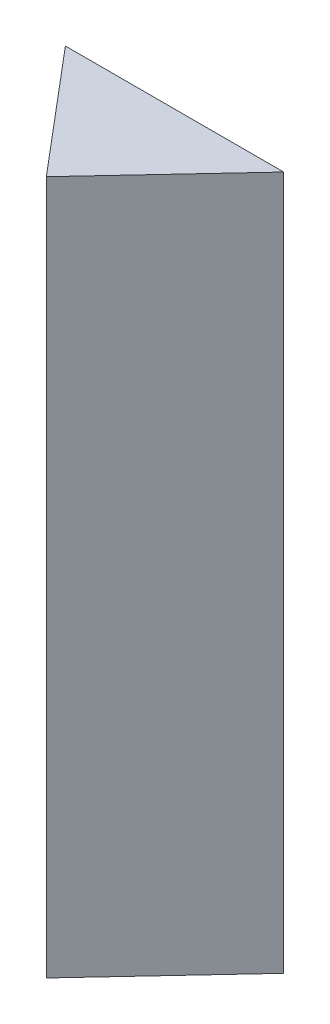
ISO-10303-21;
HEADER;
FILE_DESCRIPTION(('STEP AP214'),'2;1');
FILE_NAME('part.step','',(''),(''),'','','');
FILE_SCHEMA(('AUTOMOTIVE_DESIGN { 1 0 10303 214 1 1 1 1 }'));
ENDSEC;
DATA;
#1=APPLICATION_CONTEXT('core data for automotive mechanical design processes');
#2=APPLICATION_PROTOCOL_DEFINITION('international standard','automotive_design',2000,#1);
#3=PRODUCT_CONTEXT('',#1,'mechanical');
#4=PRODUCT('Part','Part','',(#3));
#5=PRODUCT_RELATED_PRODUCT_CATEGORY('part','',(#4));
#6=PRODUCT_DEFINITION_FORMATION('','',#4);
#7=PRODUCT_DEFINITION_CONTEXT('part definition',#1,'design');
#8=PRODUCT_DEFINITION('design','',#6,#7);
#9=PRODUCT_DEFINITION_SHAPE('','',#8);
#10=(LENGTH_UNIT() NAMED_UNIT(*) SI_UNIT(.MILLI.,.METRE.));
#11=(NAMED_UNIT(*) PLANE_ANGLE_UNIT() SI_UNIT($,.RADIAN.));
#12=(NAMED_UNIT(*) SI_UNIT($,.STERADIAN.) SOLID_ANGLE_UNIT());
#13=UNCERTAINTY_MEASURE_WITH_UNIT(LENGTH_MEASURE(1.E-05),#10,'distance_accuracy_value','');
#14=(GEOMETRIC_REPRESENTATION_CONTEXT(3) GLOBAL_UNCERTAINTY_ASSIGNED_CONTEXT((#13)) GLOBAL_UNIT_ASSIGNED_CONTEXT((#10,
#11,#12)) REPRESENTATION_CONTEXT('',''));
#15=CARTESIAN_POINT('',(0.,0.,0.));
#16=DIRECTION('',(0.,0.,1.));
#17=DIRECTION('',(1.,0.,0.));
#18=AXIS2_PLACEMENT_3D('',#15,#16,#17);
#19=CARTESIAN_POINT('',(-0.637746930190945,163.822746325072,14.2792349487924));
#20=DIRECTION('',(0.730788160116977,0.,0.682604325383925));
#21=DIRECTION('',(0.682604325383925,0.,-0.730788160116977));
#22=AXIS2_PLACEMENT_3D('',#19,#20,#21);
#23=PLANE('',#22);
#24=DIRECTION('',(0.682604325383925,0.,-0.730788160116977));
#25=VECTOR('',#24,1.);
#26=CARTESIAN_POINT('',(-0.637746930190846,134.684171355805,14.2792349487924));
#27=LINE('',#26,#25);
#28=CARTESIAN_POINT('',(-0.637746930190733,134.684171355805,14.2792349487926));
#29=VERTEX_POINT('',#28);
#30=CARTESIAN_POINT('',(12.7000000063503,134.684171355805,-6.79968112142628E-09));
#31=VERTEX_POINT('',#30);
#32=EDGE_CURVE('E48',#29,#31,#27,.T.);
#33=ORIENTED_EDGE('',*,*,#32,.F.);
#34=DIRECTION('',(0.,-1.,0.));
#35=VECTOR('',#34,1.);
#36=CARTESIAN_POINT('',(-0.637746930190945,163.822746325072,14.2792349487924));
#37=LINE('',#36,#35);
#38=CARTESIAN_POINT('',(-0.637746930190571,53.9367449206354,14.2792349487926));
#39=VERTEX_POINT('',#38);
#40=EDGE_CURVE('E70',#29,#39,#37,.T.);
#41=ORIENTED_EDGE('',*,*,#40,.T.);
#42=DIRECTION('',(-0.682604325383925,0.,0.730788160116977));
#43=VECTOR('',#42,1.);
#44=CARTESIAN_POINT('',(-0.637746930190571,53.9367449206354,14.2792349487926));
#45=LINE('',#44,#43);
#46=CARTESIAN_POINT('',(12.7000000063503,53.9367449206354,-6.79954249207029E-09));
#47=VERTEX_POINT('',#46);
#48=EDGE_CURVE('E74',#47,#39,#45,.T.);
#49=ORIENTED_EDGE('',*,*,#48,.F.);
#50=DIRECTION('',(0.,-1.,0.));
#51=VECTOR('',#50,1.);
#52=CARTESIAN_POINT('',(12.7000000063499,163.822746325072,-6.7997311473163E-09));
#53=LINE('',#52,#51);
#54=EDGE_CURVE('E92',#31,#47,#53,.T.);
#55=ORIENTED_EDGE('',*,*,#54,.F.);
#56=EDGE_LOOP('',(#33,#41,#49,#55));
#57=FACE_BOUND('',#56,.T.);
#58=ADVANCED_FACE('F41',(#57),#23,.T.);
#59=CARTESIAN_POINT('',(12.7000000063499,163.822746325072,-6.7997311473163E-09));
#60=DIRECTION('',(-2.67609643914053E-10,0.,-1.));
#61=DIRECTION('',(-1.,0.,2.67609643914053E-10));
#62=AXIS2_PLACEMENT_3D('',#59,#60,#61);
#63=PLANE('',#62);
#64=DIRECTION('',(-1.,0.,2.67609643914053E-10));
#65=VECTOR('',#64,1.);
#66=CARTESIAN_POINT('',(12.70000000635,134.684171355805,-6.7996811214262E-09));
#67=LINE('',#66,#65);
#68=CARTESIAN_POINT('',(-12.7000000000001,134.684171355805,-2.39616430991364E-12));
#69=VERTEX_POINT('',#68);
#70=EDGE_CURVE('E94',#31,#69,#67,.T.);
#71=ORIENTED_EDGE('',*,*,#70,.F.);
#72=ORIENTED_EDGE('',*,*,#54,.T.);
#73=DIRECTION('',(1.,0.,-2.67609643914053E-10));
#74=VECTOR('',#73,1.);
#75=CARTESIAN_POINT('',(12.7000000063503,53.9367449206354,-6.79954249207029E-09));
#76=LINE('',#75,#74);
#77=CARTESIAN_POINT('',(-12.6999999999999,53.9367449206353,-2.25753495400157E-12));
#78=VERTEX_POINT('',#77);
#79=EDGE_CURVE('E78',#78,#47,#76,.T.);
#80=ORIENTED_EDGE('',*,*,#79,.F.);
#81=DIRECTION('',(0.,-1.,0.));
#82=VECTOR('',#81,1.);
#83=CARTESIAN_POINT('',(-12.7000000000002,163.822746325071,-2.44619020000721E-12));
#84=LINE('',#83,#82);
#85=EDGE_CURVE('E77',#69,#78,#84,.T.);
#86=ORIENTED_EDGE('',*,*,#85,.F.);
#87=EDGE_LOOP('',(#71,#72,#80,#86));
#88=FACE_BOUND('',#87,.T.);
#89=ADVANCED_FACE('F97',(#88),#63,.T.);
#90=CARTESIAN_POINT('',(-12.7000000000002,163.822746325071,-2.44619020000721E-12));
#91=DIRECTION('',(-0.763918288724921,0.,0.645312984645116));
#92=DIRECTION('',(0.645312984645116,0.,0.763918288724921));
#93=AXIS2_PLACEMENT_3D('',#90,#91,#92);
#94=PLANE('',#93);
#95=DIRECTION('',(0.645312984645116,0.,0.763918288724921));
#96=VECTOR('',#95,1.);
#97=CARTESIAN_POINT('',(-12.7000000000001,134.684171355805,-2.39616430991364E-12));
#98=LINE('',#97,#96);
#99=EDGE_CURVE('E11',#69,#29,#98,.T.);
#100=ORIENTED_EDGE('',*,*,#99,.F.);
#101=ORIENTED_EDGE('',*,*,#85,.T.);
#102=DIRECTION('',(-0.645312984645116,0.,-0.763918288724921));
#103=VECTOR('',#102,1.);
#104=CARTESIAN_POINT('',(-12.6999999999999,53.9367449206353,-2.25753495400157E-12));
#105=LINE('',#104,#103);
#106=EDGE_CURVE('E80',#39,#78,#105,.T.);
#107=ORIENTED_EDGE('',*,*,#106,.F.);
#108=ORIENTED_EDGE('',*,*,#40,.F.);
#109=EDGE_LOOP('',(#100,#101,#107,#108));
#110=FACE_BOUND('',#109,.T.);
#111=ADVANCED_FACE('F81',(#110),#94,.T.);
#112=CARTESIAN_POINT('',(-1.76816386054413E-13,53.9367449206354,0.));
#113=DIRECTION('',(0.,-1.,0.));
#114=DIRECTION('',(1.,0.,0.));
#115=AXIS2_PLACEMENT_3D('',#112,#113,#114);
#116=PLANE('',#115);
#117=ORIENTED_EDGE('',*,*,#48,.T.);
#118=ORIENTED_EDGE('',*,*,#106,.T.);
#119=ORIENTED_EDGE('',*,*,#79,.T.);
#120=EDGE_LOOP('',(#117,#118,#119));
#121=FACE_BOUND('',#120,.T.);
#122=ADVANCED_FACE('F86',(#121),#116,.T.);
#123=CARTESIAN_POINT('',(-53.5994889438104,134.684171355805,73.3234169206169));
#124=DIRECTION('',(0.,-1.,0.));
#125=DIRECTION('',(-0.730788160116977,0.,-0.682604325383925));
#126=AXIS2_PLACEMENT_3D('',#123,#124,#125);
#127=PLANE('',#126);
#128=ORIENTED_EDGE('',*,*,#32,.T.);
#129=ORIENTED_EDGE('',*,*,#70,.T.);
#130=ORIENTED_EDGE('',*,*,#99,.T.);
#131=EDGE_LOOP('',(#128,#129,#130));
#132=FACE_BOUND('',#131,.T.);
#133=ADVANCED_FACE('F96',(#132),#127,.F.);
#134=CLOSED_SHELL('',(#58,#89,#111,#122,#133));
#135=MANIFOLD_SOLID_BREP('B2',#134);
#136=ADVANCED_BREP_SHAPE_REPRESENTATION('',(#18,#135),#14);
#137=SHAPE_DEFINITION_REPRESENTATION(#9,#136);
ENDSEC;
END-ISO-10303-21;
